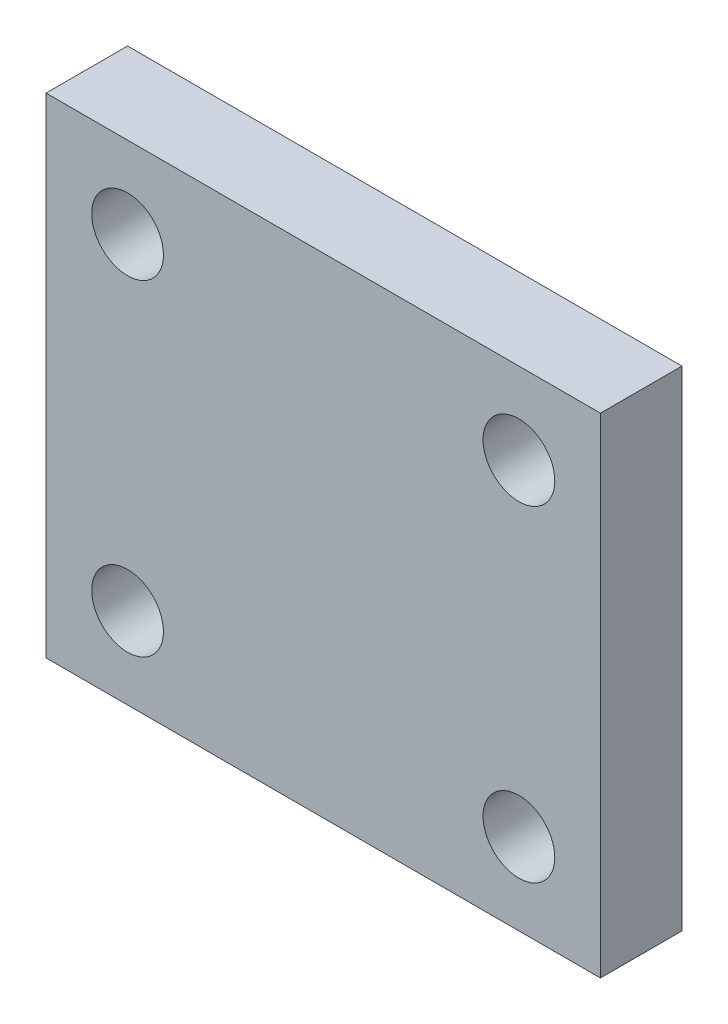
ISO-10303-21;
HEADER;
FILE_DESCRIPTION(('STEP AP214'),'2;1');
FILE_NAME('part.step','',(''),(''),'','','');
FILE_SCHEMA(('AUTOMOTIVE_DESIGN { 1 0 10303 214 1 1 1 1 }'));
ENDSEC;
DATA;
#1=APPLICATION_CONTEXT('core data for automotive mechanical design processes');
#2=APPLICATION_PROTOCOL_DEFINITION('international standard','automotive_design',2000,#1);
#3=PRODUCT_CONTEXT('',#1,'mechanical');
#4=PRODUCT('Part','Part','',(#3));
#5=PRODUCT_RELATED_PRODUCT_CATEGORY('part','',(#4));
#6=PRODUCT_DEFINITION_FORMATION('','',#4);
#7=PRODUCT_DEFINITION_CONTEXT('part definition',#1,'design');
#8=PRODUCT_DEFINITION('design','',#6,#7);
#9=PRODUCT_DEFINITION_SHAPE('','',#8);
#10=(LENGTH_UNIT() NAMED_UNIT(*) SI_UNIT(.MILLI.,.METRE.));
#11=(NAMED_UNIT(*) PLANE_ANGLE_UNIT() SI_UNIT($,.RADIAN.));
#12=(NAMED_UNIT(*) SI_UNIT($,.STERADIAN.) SOLID_ANGLE_UNIT());
#13=UNCERTAINTY_MEASURE_WITH_UNIT(LENGTH_MEASURE(1.E-05),#10,'distance_accuracy_value','');
#14=(GEOMETRIC_REPRESENTATION_CONTEXT(3) GLOBAL_UNCERTAINTY_ASSIGNED_CONTEXT((#13)) GLOBAL_UNIT_ASSIGNED_CONTEXT((#10,
#11,#12)) REPRESENTATION_CONTEXT('',''));
#15=CARTESIAN_POINT('',(0.,0.,0.));
#16=DIRECTION('',(0.,0.,1.));
#17=DIRECTION('',(1.,0.,0.));
#18=AXIS2_PLACEMENT_3D('',#15,#16,#17);
#19=CARTESIAN_POINT('',(17.,15.,5.));
#20=DIRECTION('',(-1.,0.,0.));
#21=DIRECTION('',(0.,-1.,0.));
#22=AXIS2_PLACEMENT_3D('',#19,#20,#21);
#23=PLANE('',#22);
#24=DIRECTION('',(0.,1.,0.));
#25=VECTOR('',#24,1.);
#26=CARTESIAN_POINT('',(17.,15.,0.));
#27=LINE('',#26,#25);
#28=CARTESIAN_POINT('',(17.,-15.,0.));
#29=VERTEX_POINT('',#28);
#30=CARTESIAN_POINT('',(17.,15.,0.));
#31=VERTEX_POINT('',#30);
#32=EDGE_CURVE('E104',#29,#31,#27,.T.);
#33=ORIENTED_EDGE('',*,*,#32,.T.);
#34=DIRECTION('',(0.,0.,-1.));
#35=VECTOR('',#34,1.);
#36=CARTESIAN_POINT('',(17.,15.,5.));
#37=LINE('',#36,#35);
#38=CARTESIAN_POINT('',(17.,15.,5.));
#39=VERTEX_POINT('',#38);
#40=EDGE_CURVE('E11',#39,#31,#37,.T.);
#41=ORIENTED_EDGE('',*,*,#40,.F.);
#42=DIRECTION('',(0.,1.,0.));
#43=VECTOR('',#42,1.);
#44=CARTESIAN_POINT('',(17.,15.,5.));
#45=LINE('',#44,#43);
#46=CARTESIAN_POINT('',(17.,-15.,5.));
#47=VERTEX_POINT('',#46);
#48=EDGE_CURVE('E92',#47,#39,#45,.T.);
#49=ORIENTED_EDGE('',*,*,#48,.F.);
#50=DIRECTION('',(0.,0.,-1.));
#51=VECTOR('',#50,1.);
#52=CARTESIAN_POINT('',(17.,-15.,5.));
#53=LINE('',#52,#51);
#54=EDGE_CURVE('E100',#47,#29,#53,.T.);
#55=ORIENTED_EDGE('',*,*,#54,.T.);
#56=EDGE_LOOP('',(#33,#41,#49,#55));
#57=FACE_BOUND('',#56,.T.);
#58=ADVANCED_FACE('F41',(#57),#23,.F.);
#59=CARTESIAN_POINT('',(-17.,15.,5.));
#60=DIRECTION('',(0.,-1.,0.));
#61=DIRECTION('',(0.,0.,-1.));
#62=AXIS2_PLACEMENT_3D('',#59,#60,#61);
#63=PLANE('',#62);
#64=DIRECTION('',(-1.,0.,0.));
#65=VECTOR('',#64,1.);
#66=CARTESIAN_POINT('',(-17.,15.,0.));
#67=LINE('',#66,#65);
#68=CARTESIAN_POINT('',(-17.,15.,0.));
#69=VERTEX_POINT('',#68);
#70=EDGE_CURVE('E96',#31,#69,#67,.T.);
#71=ORIENTED_EDGE('',*,*,#70,.T.);
#72=DIRECTION('',(0.,0.,-1.));
#73=VECTOR('',#72,1.);
#74=CARTESIAN_POINT('',(-17.,15.,5.));
#75=LINE('',#74,#73);
#76=CARTESIAN_POINT('',(-17.,15.,5.));
#77=VERTEX_POINT('',#76);
#78=EDGE_CURVE('E49',#77,#69,#75,.T.);
#79=ORIENTED_EDGE('',*,*,#78,.F.);
#80=DIRECTION('',(-1.,0.,0.));
#81=VECTOR('',#80,1.);
#82=CARTESIAN_POINT('',(-17.,15.,5.));
#83=LINE('',#82,#81);
#84=EDGE_CURVE('E87',#39,#77,#83,.T.);
#85=ORIENTED_EDGE('',*,*,#84,.F.);
#86=ORIENTED_EDGE('',*,*,#40,.T.);
#87=EDGE_LOOP('',(#71,#79,#85,#86));
#88=FACE_BOUND('',#87,.T.);
#89=ADVANCED_FACE('F95',(#88),#63,.F.);
#90=CARTESIAN_POINT('',(-17.,15.,5.));
#91=DIRECTION('',(1.,0.,0.));
#92=DIRECTION('',(0.,1.,0.));
#93=AXIS2_PLACEMENT_3D('',#90,#91,#92);
#94=PLANE('',#93);
#95=DIRECTION('',(0.,-1.,0.));
#96=VECTOR('',#95,1.);
#97=CARTESIAN_POINT('',(-17.,15.,0.));
#98=LINE('',#97,#96);
#99=CARTESIAN_POINT('',(-17.,-15.,0.));
#100=VERTEX_POINT('',#99);
#101=EDGE_CURVE('E74',#69,#100,#98,.T.);
#102=ORIENTED_EDGE('',*,*,#101,.T.);
#103=DIRECTION('',(0.,0.,-1.));
#104=VECTOR('',#103,1.);
#105=CARTESIAN_POINT('',(-17.,-15.,5.));
#106=LINE('',#105,#104);
#107=CARTESIAN_POINT('',(-17.,-15.,5.));
#108=VERTEX_POINT('',#107);
#109=EDGE_CURVE('E97',#108,#100,#106,.T.);
#110=ORIENTED_EDGE('',*,*,#109,.F.);
#111=DIRECTION('',(0.,-1.,0.));
#112=VECTOR('',#111,1.);
#113=CARTESIAN_POINT('',(-17.,15.,5.));
#114=LINE('',#113,#112);
#115=EDGE_CURVE('E90',#77,#108,#114,.T.);
#116=ORIENTED_EDGE('',*,*,#115,.F.);
#117=ORIENTED_EDGE('',*,*,#78,.T.);
#118=EDGE_LOOP('',(#102,#110,#116,#117));
#119=FACE_BOUND('',#118,.T.);
#120=ADVANCED_FACE('F98',(#119),#94,.F.);
#121=CARTESIAN_POINT('',(-17.,-15.,5.));
#122=DIRECTION('',(0.,1.,0.));
#123=DIRECTION('',(0.,0.,1.));
#124=AXIS2_PLACEMENT_3D('',#121,#122,#123);
#125=PLANE('',#124);
#126=DIRECTION('',(1.,0.,0.));
#127=VECTOR('',#126,1.);
#128=CARTESIAN_POINT('',(-17.,-15.,0.));
#129=LINE('',#128,#127);
#130=EDGE_CURVE('E80',#100,#29,#129,.T.);
#131=ORIENTED_EDGE('',*,*,#130,.T.);
#132=ORIENTED_EDGE('',*,*,#54,.F.);
#133=DIRECTION('',(1.,0.,0.));
#134=VECTOR('',#133,1.);
#135=CARTESIAN_POINT('',(-17.,-15.,5.));
#136=LINE('',#135,#134);
#137=EDGE_CURVE('E57',#108,#47,#136,.T.);
#138=ORIENTED_EDGE('',*,*,#137,.F.);
#139=ORIENTED_EDGE('',*,*,#109,.T.);
#140=EDGE_LOOP('',(#131,#132,#138,#139));
#141=FACE_BOUND('',#140,.T.);
#142=ADVANCED_FACE('F112',(#141),#125,.F.);
#143=CARTESIAN_POINT('',(0.,0.,5.));
#144=DIRECTION('',(0.,0.,1.));
#145=DIRECTION('',(1.,0.,0.));
#146=AXIS2_PLACEMENT_3D('',#143,#144,#145);
#147=PLANE('',#146);
#148=CARTESIAN_POINT('',(-12.,10.,5.));
#149=DIRECTION('',(0.,0.,1.));
#150=DIRECTION('',(1.,0.,0.));
#151=AXIS2_PLACEMENT_3D('',#148,#149,#150);
#152=CIRCLE('',#151,2.20000000000001);
#153=CARTESIAN_POINT('',(-9.79999999999999,10.,5.));
#154=VERTEX_POINT('',#153);
#155=EDGE_CURVE('E138',#154,#154,#152,.T.);
#156=ORIENTED_EDGE('',*,*,#155,.F.);
#157=EDGE_LOOP('',(#156));
#158=FACE_BOUND('',#157,.T.);
#159=CARTESIAN_POINT('',(12.,10.,5.));
#160=DIRECTION('',(0.,0.,1.));
#161=DIRECTION('',(1.,0.,0.));
#162=AXIS2_PLACEMENT_3D('',#159,#160,#161);
#163=CIRCLE('',#162,2.20000000000001);
#164=CARTESIAN_POINT('',(14.2,10.,5.));
#165=VERTEX_POINT('',#164);
#166=EDGE_CURVE('E132',#165,#165,#163,.T.);
#167=ORIENTED_EDGE('',*,*,#166,.F.);
#168=EDGE_LOOP('',(#167));
#169=FACE_BOUND('',#168,.T.);
#170=CARTESIAN_POINT('',(12.,-10.,5.));
#171=DIRECTION('',(0.,0.,1.));
#172=DIRECTION('',(1.,0.,0.));
#173=AXIS2_PLACEMENT_3D('',#170,#171,#172);
#174=CIRCLE('',#173,2.20000000000001);
#175=CARTESIAN_POINT('',(14.2,-10.,5.));
#176=VERTEX_POINT('',#175);
#177=EDGE_CURVE('E126',#176,#176,#174,.T.);
#178=ORIENTED_EDGE('',*,*,#177,.F.);
#179=EDGE_LOOP('',(#178));
#180=FACE_BOUND('',#179,.T.);
#181=CARTESIAN_POINT('',(-12.,-10.,5.));
#182=DIRECTION('',(0.,0.,1.));
#183=DIRECTION('',(1.,0.,0.));
#184=AXIS2_PLACEMENT_3D('',#181,#182,#183);
#185=CIRCLE('',#184,2.20000000000001);
#186=CARTESIAN_POINT('',(-9.79999999999999,-10.,5.));
#187=VERTEX_POINT('',#186);
#188=EDGE_CURVE('E120',#187,#187,#185,.T.);
#189=ORIENTED_EDGE('',*,*,#188,.F.);
#190=EDGE_LOOP('',(#189));
#191=FACE_BOUND('',#190,.T.);
#192=ORIENTED_EDGE('',*,*,#48,.T.);
#193=ORIENTED_EDGE('',*,*,#84,.T.);
#194=ORIENTED_EDGE('',*,*,#115,.T.);
#195=ORIENTED_EDGE('',*,*,#137,.T.);
#196=EDGE_LOOP('',(#192,#193,#194,#195));
#197=FACE_BOUND('',#196,.T.);
#198=ADVANCED_FACE('F88',(#158,#169,#180,#191,#197),#147,.T.);
#199=CARTESIAN_POINT('',(0.,0.,0.));
#200=DIRECTION('',(0.,0.,1.));
#201=DIRECTION('',(1.,0.,0.));
#202=AXIS2_PLACEMENT_3D('',#199,#200,#201);
#203=PLANE('',#202);
#204=CARTESIAN_POINT('',(-12.,10.,0.));
#205=DIRECTION('',(0.,0.,1.));
#206=DIRECTION('',(1.,0.,0.));
#207=AXIS2_PLACEMENT_3D('',#204,#205,#206);
#208=CIRCLE('',#207,2.20000000000001);
#209=CARTESIAN_POINT('',(-9.79999999999999,10.,0.));
#210=VERTEX_POINT('',#209);
#211=EDGE_CURVE('E135',#210,#210,#208,.T.);
#212=ORIENTED_EDGE('',*,*,#211,.T.);
#213=EDGE_LOOP('',(#212));
#214=FACE_BOUND('',#213,.T.);
#215=CARTESIAN_POINT('',(12.,10.,0.));
#216=DIRECTION('',(0.,0.,1.));
#217=DIRECTION('',(1.,0.,0.));
#218=AXIS2_PLACEMENT_3D('',#215,#216,#217);
#219=CIRCLE('',#218,2.20000000000001);
#220=CARTESIAN_POINT('',(14.2,10.,0.));
#221=VERTEX_POINT('',#220);
#222=EDGE_CURVE('E129',#221,#221,#219,.T.);
#223=ORIENTED_EDGE('',*,*,#222,.T.);
#224=EDGE_LOOP('',(#223));
#225=FACE_BOUND('',#224,.T.);
#226=CARTESIAN_POINT('',(12.,-10.,0.));
#227=DIRECTION('',(0.,0.,1.));
#228=DIRECTION('',(1.,0.,0.));
#229=AXIS2_PLACEMENT_3D('',#226,#227,#228);
#230=CIRCLE('',#229,2.20000000000001);
#231=CARTESIAN_POINT('',(14.2,-10.,0.));
#232=VERTEX_POINT('',#231);
#233=EDGE_CURVE('E123',#232,#232,#230,.T.);
#234=ORIENTED_EDGE('',*,*,#233,.T.);
#235=EDGE_LOOP('',(#234));
#236=FACE_BOUND('',#235,.T.);
#237=CARTESIAN_POINT('',(-12.,-10.,0.));
#238=DIRECTION('',(0.,0.,1.));
#239=DIRECTION('',(1.,0.,0.));
#240=AXIS2_PLACEMENT_3D('',#237,#238,#239);
#241=CIRCLE('',#240,2.20000000000001);
#242=CARTESIAN_POINT('',(-9.79999999999999,-10.,0.));
#243=VERTEX_POINT('',#242);
#244=EDGE_CURVE('E107',#243,#243,#241,.T.);
#245=ORIENTED_EDGE('',*,*,#244,.T.);
#246=EDGE_LOOP('',(#245));
#247=FACE_BOUND('',#246,.T.);
#248=ORIENTED_EDGE('',*,*,#32,.F.);
#249=ORIENTED_EDGE('',*,*,#130,.F.);
#250=ORIENTED_EDGE('',*,*,#101,.F.);
#251=ORIENTED_EDGE('',*,*,#70,.F.);
#252=EDGE_LOOP('',(#248,#249,#250,#251));
#253=FACE_BOUND('',#252,.T.);
#254=ADVANCED_FACE('F115',(#214,#225,#236,#247,#253),#203,.F.);
#255=CARTESIAN_POINT('',(-12.,-10.,5.));
#256=DIRECTION('',(0.,0.,1.));
#257=DIRECTION('',(1.,0.,0.));
#258=AXIS2_PLACEMENT_3D('',#255,#256,#257);
#259=CYLINDRICAL_SURFACE('',#258,2.20000000000001);
#260=ORIENTED_EDGE('',*,*,#244,.F.);
#261=EDGE_LOOP('',(#260));
#262=FACE_BOUND('',#261,.T.);
#263=ORIENTED_EDGE('',*,*,#188,.T.);
#264=EDGE_LOOP('',(#263));
#265=FACE_BOUND('',#264,.T.);
#266=ADVANCED_FACE('F153',(#262,#265),#259,.F.);
#267=CARTESIAN_POINT('',(12.,-10.,5.));
#268=DIRECTION('',(0.,0.,1.));
#269=DIRECTION('',(1.,0.,0.));
#270=AXIS2_PLACEMENT_3D('',#267,#268,#269);
#271=CYLINDRICAL_SURFACE('',#270,2.20000000000001);
#272=ORIENTED_EDGE('',*,*,#233,.F.);
#273=EDGE_LOOP('',(#272));
#274=FACE_BOUND('',#273,.T.);
#275=ORIENTED_EDGE('',*,*,#177,.T.);
#276=EDGE_LOOP('',(#275));
#277=FACE_BOUND('',#276,.T.);
#278=ADVANCED_FACE('F155',(#274,#277),#271,.F.);
#279=CARTESIAN_POINT('',(12.,10.,5.));
#280=DIRECTION('',(0.,0.,1.));
#281=DIRECTION('',(1.,0.,0.));
#282=AXIS2_PLACEMENT_3D('',#279,#280,#281);
#283=CYLINDRICAL_SURFACE('',#282,2.20000000000001);
#284=ORIENTED_EDGE('',*,*,#222,.F.);
#285=EDGE_LOOP('',(#284));
#286=FACE_BOUND('',#285,.T.);
#287=ORIENTED_EDGE('',*,*,#166,.T.);
#288=EDGE_LOOP('',(#287));
#289=FACE_BOUND('',#288,.T.);
#290=ADVANCED_FACE('F162',(#286,#289),#283,.F.);
#291=CARTESIAN_POINT('',(-12.,10.,5.));
#292=DIRECTION('',(0.,0.,1.));
#293=DIRECTION('',(1.,0.,0.));
#294=AXIS2_PLACEMENT_3D('',#291,#292,#293);
#295=CYLINDRICAL_SURFACE('',#294,2.20000000000001);
#296=ORIENTED_EDGE('',*,*,#211,.F.);
#297=EDGE_LOOP('',(#296));
#298=FACE_BOUND('',#297,.T.);
#299=ORIENTED_EDGE('',*,*,#155,.T.);
#300=EDGE_LOOP('',(#299));
#301=FACE_BOUND('',#300,.T.);
#302=ADVANCED_FACE('F142',(#298,#301),#295,.F.);
#303=CLOSED_SHELL('',(#58,#89,#120,#142,#198,#254,#266,#278,#290,#302));
#304=MANIFOLD_SOLID_BREP('B2',#303);
#305=ADVANCED_BREP_SHAPE_REPRESENTATION('',(#18,#304),#14);
#306=SHAPE_DEFINITION_REPRESENTATION(#9,#305);
ENDSEC;
END-ISO-10303-21;
